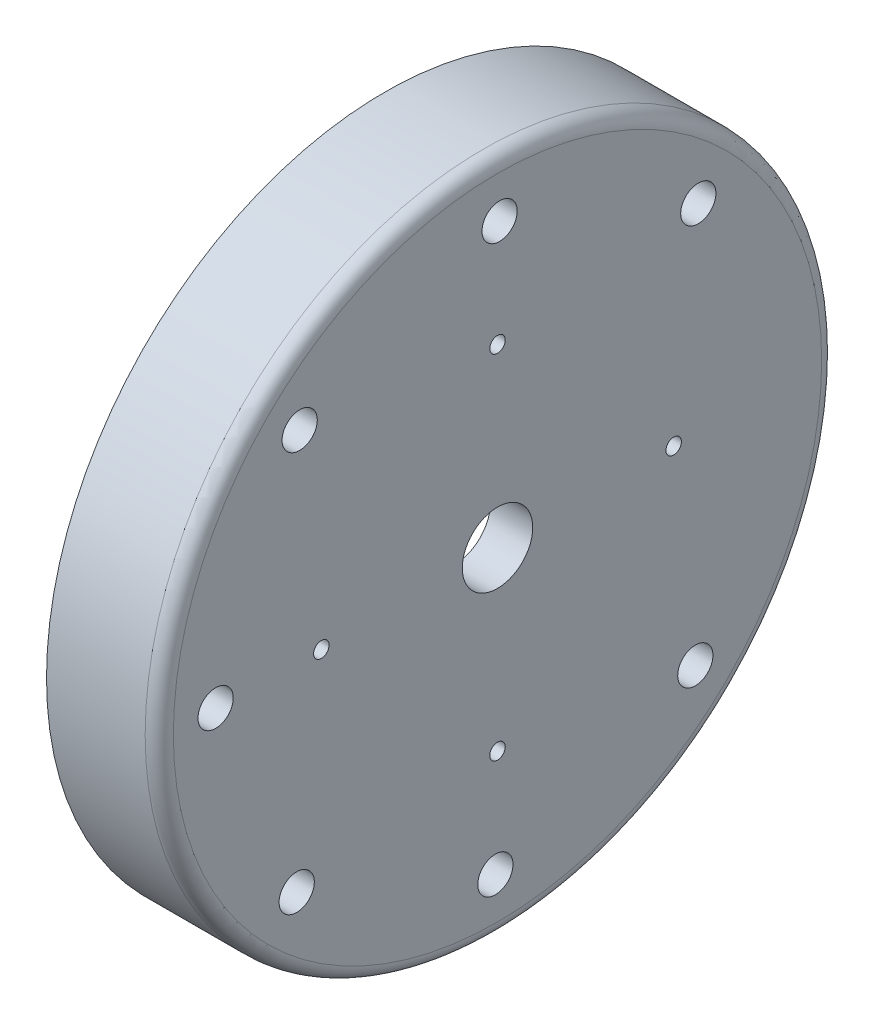
ISO-10303-21;
HEADER;
FILE_DESCRIPTION(('STEP AP214'),'2;1');
FILE_NAME('part.step','',(''),(''),'','','');
FILE_SCHEMA(('AUTOMOTIVE_DESIGN { 1 0 10303 214 1 1 1 1 }'));
ENDSEC;
DATA;
#1=APPLICATION_CONTEXT('core data for automotive mechanical design processes');
#2=APPLICATION_PROTOCOL_DEFINITION('international standard','automotive_design',2000,#1);
#3=PRODUCT_CONTEXT('',#1,'mechanical');
#4=PRODUCT('Part','Part','',(#3));
#5=PRODUCT_RELATED_PRODUCT_CATEGORY('part','',(#4));
#6=PRODUCT_DEFINITION_FORMATION('','',#4);
#7=PRODUCT_DEFINITION_CONTEXT('part definition',#1,'design');
#8=PRODUCT_DEFINITION('design','',#6,#7);
#9=PRODUCT_DEFINITION_SHAPE('','',#8);
#10=(LENGTH_UNIT() NAMED_UNIT(*) SI_UNIT(.MILLI.,.METRE.));
#11=(NAMED_UNIT(*) PLANE_ANGLE_UNIT() SI_UNIT($,.RADIAN.));
#12=(NAMED_UNIT(*) SI_UNIT($,.STERADIAN.) SOLID_ANGLE_UNIT());
#13=UNCERTAINTY_MEASURE_WITH_UNIT(LENGTH_MEASURE(1.E-05),#10,'distance_accuracy_value','');
#14=(GEOMETRIC_REPRESENTATION_CONTEXT(3) GLOBAL_UNCERTAINTY_ASSIGNED_CONTEXT((#13)) GLOBAL_UNIT_ASSIGNED_CONTEXT((#10,
#11,#12)) REPRESENTATION_CONTEXT('',''));
#15=CARTESIAN_POINT('',(0.,0.,0.));
#16=DIRECTION('',(0.,0.,1.));
#17=DIRECTION('',(1.,0.,0.));
#18=AXIS2_PLACEMENT_3D('',#15,#16,#17);
#19=CARTESIAN_POINT('',(20.32,0.,0.));
#20=DIRECTION('',(-1.,0.,0.));
#21=DIRECTION('',(0.,0.,1.));
#22=AXIS2_PLACEMENT_3D('',#19,#20,#21);
#23=CYLINDRICAL_SURFACE('',#22,60.96);
#24=CARTESIAN_POINT('',(17.78,0.,0.));
#25=DIRECTION('',(1.,0.,0.));
#26=DIRECTION('',(0.,0.,-1.));
#27=AXIS2_PLACEMENT_3D('',#24,#25,#26);
#28=CIRCLE('',#27,60.96);
#29=CARTESIAN_POINT('',(17.78,0.,-60.96));
#30=VERTEX_POINT('',#29);
#31=EDGE_CURVE('E11',#30,#30,#28,.F.);
#32=ORIENTED_EDGE('',*,*,#31,.T.);
#33=EDGE_LOOP('',(#32));
#34=FACE_BOUND('',#33,.T.);
#35=CARTESIAN_POINT('',(0.,0.,0.));
#36=DIRECTION('',(1.,0.,0.));
#37=DIRECTION('',(0.,0.,-1.));
#38=AXIS2_PLACEMENT_3D('',#35,#36,#37);
#39=CIRCLE('',#38,60.96);
#40=CARTESIAN_POINT('',(0.,0.,-60.96));
#41=VERTEX_POINT('',#40);
#42=EDGE_CURVE('E47',#41,#41,#39,.T.);
#43=ORIENTED_EDGE('',*,*,#42,.T.);
#44=EDGE_LOOP('',(#43));
#45=FACE_BOUND('',#44,.T.);
#46=ADVANCED_FACE('F35',(#34,#45),#23,.T.);
#47=CARTESIAN_POINT('',(20.32,0.,0.));
#48=DIRECTION('',(1.,0.,0.));
#49=DIRECTION('',(0.,0.,-1.));
#50=AXIS2_PLACEMENT_3D('',#47,#48,#49);
#51=PLANE('',#50);
#52=CARTESIAN_POINT('',(20.32,31.75,0.));
#53=DIRECTION('',(1.,0.,0.));
#54=DIRECTION('',(0.,0.,-1.));
#55=AXIS2_PLACEMENT_3D('',#52,#53,#54);
#56=CIRCLE('',#55,1.397);
#57=CARTESIAN_POINT('',(20.32,31.75,-1.397));
#58=VERTEX_POINT('',#57);
#59=EDGE_CURVE('E103',#58,#58,#56,.F.);
#60=ORIENTED_EDGE('',*,*,#59,.T.);
#61=EDGE_LOOP('',(#60));
#62=FACE_BOUND('',#61,.T.);
#63=CARTESIAN_POINT('',(20.32,-1.10854532508269E-13,31.75));
#64=DIRECTION('',(1.,0.,0.));
#65=DIRECTION('',(0.,0.,-1.));
#66=AXIS2_PLACEMENT_3D('',#63,#64,#65);
#67=CIRCLE('',#66,1.39700000000001);
#68=CARTESIAN_POINT('',(20.32,-1.10854532508269E-13,30.353));
#69=VERTEX_POINT('',#68);
#70=EDGE_CURVE('E117',#69,#69,#67,.F.);
#71=ORIENTED_EDGE('',*,*,#70,.T.);
#72=EDGE_LOOP('',(#71));
#73=FACE_BOUND('',#72,.T.);
#74=CARTESIAN_POINT('',(20.32,-31.75,-2.21709065016539E-13));
#75=DIRECTION('',(1.,0.,0.));
#76=DIRECTION('',(0.,0.,-1.));
#77=AXIS2_PLACEMENT_3D('',#74,#75,#76);
#78=CIRCLE('',#77,1.397);
#79=CARTESIAN_POINT('',(20.32,-31.75,-1.39700000000022));
#80=VERTEX_POINT('',#79);
#81=EDGE_CURVE('E111',#80,#80,#78,.F.);
#82=ORIENTED_EDGE('',*,*,#81,.T.);
#83=EDGE_LOOP('',(#82));
#84=FACE_BOUND('',#83,.T.);
#85=CARTESIAN_POINT('',(20.32,3.32563597524808E-13,-31.75));
#86=DIRECTION('',(1.,0.,0.));
#87=DIRECTION('',(0.,0.,-1.));
#88=AXIS2_PLACEMENT_3D('',#85,#86,#87);
#89=CIRCLE('',#88,1.397);
#90=CARTESIAN_POINT('',(20.32,3.32563597524808E-13,-33.147));
#91=VERTEX_POINT('',#90);
#92=EDGE_CURVE('E104',#91,#91,#89,.F.);
#93=ORIENTED_EDGE('',*,*,#92,.T.);
#94=EDGE_LOOP('',(#93));
#95=FACE_BOUND('',#94,.T.);
#96=CARTESIAN_POINT('',(20.32,50.7985782495741,-0.380062918335537));
#97=DIRECTION('',(-1.,0.,0.));
#98=DIRECTION('',(0.,-0.707106781186549,0.707106781186546));
#99=AXIS2_PLACEMENT_3D('',#96,#97,#98);
#100=CIRCLE('',#99,3.175);
#101=CARTESIAN_POINT('',(20.32,48.5535142193068,1.86500111193175));
#102=VERTEX_POINT('',#101);
#103=EDGE_CURVE('E59',#102,#102,#100,.T.);
#104=ORIENTED_EDGE('',*,*,#103,.T.);
#105=EDGE_LOOP('',(#104));
#106=FACE_BOUND('',#105,.T.);
#107=CARTESIAN_POINT('',(20.32,36.1887642217419,35.6512740880768));
#108=DIRECTION('',(-1.,0.,0.));
#109=DIRECTION('',(0.,-1.,0.));
#110=AXIS2_PLACEMENT_3D('',#107,#108,#109);
#111=CIRCLE('',#110,3.175);
#112=CARTESIAN_POINT('',(20.32,33.0137642217419,35.6512740880768));
#113=VERTEX_POINT('',#112);
#114=EDGE_CURVE('E89',#113,#113,#111,.T.);
#115=ORIENTED_EDGE('',*,*,#114,.T.);
#116=EDGE_LOOP('',(#115));
#117=FACE_BOUND('',#116,.T.);
#118=CARTESIAN_POINT('',(20.32,0.380062918335356,50.7985782495741));
#119=DIRECTION('',(-1.,0.,0.));
#120=DIRECTION('',(0.,-0.707106781186544,-0.707106781186551));
#121=AXIS2_PLACEMENT_3D('',#118,#119,#120);
#122=CIRCLE('',#121,3.175);
#123=CARTESIAN_POINT('',(20.32,-1.86500111193192,48.5535142193068));
#124=VERTEX_POINT('',#123);
#125=EDGE_CURVE('E83',#124,#124,#122,.T.);
#126=ORIENTED_EDGE('',*,*,#125,.T.);
#127=EDGE_LOOP('',(#126));
#128=FACE_BOUND('',#127,.T.);
#129=CARTESIAN_POINT('',(20.32,-35.6512740880767,36.188764221742));
#130=DIRECTION('',(-1.,0.,0.));
#131=DIRECTION('',(0.,0.,-1.));
#132=AXIS2_PLACEMENT_3D('',#129,#130,#131);
#133=CIRCLE('',#132,3.175);
#134=CARTESIAN_POINT('',(20.32,-35.6512740880767,33.013764221742));
#135=VERTEX_POINT('',#134);
#136=EDGE_CURVE('E77',#135,#135,#133,.T.);
#137=ORIENTED_EDGE('',*,*,#136,.T.);
#138=EDGE_LOOP('',(#137));
#139=FACE_BOUND('',#138,.T.);
#140=CARTESIAN_POINT('',(20.32,-50.7985782495741,0.380062918335179));
#141=DIRECTION('',(-1.,0.,0.));
#142=DIRECTION('',(0.,0.707106781186554,-0.707106781186541));
#143=AXIS2_PLACEMENT_3D('',#140,#141,#142);
#144=CIRCLE('',#143,3.175);
#145=CARTESIAN_POINT('',(20.32,-48.5535142193068,-1.86500111193209));
#146=VERTEX_POINT('',#145);
#147=EDGE_CURVE('E71',#146,#146,#144,.T.);
#148=ORIENTED_EDGE('',*,*,#147,.T.);
#149=EDGE_LOOP('',(#148));
#150=FACE_BOUND('',#149,.T.);
#151=CARTESIAN_POINT('',(20.32,-36.1887642217416,-35.651274088077));
#152=DIRECTION('',(-1.,0.,0.));
#153=DIRECTION('',(0.,1.,0.));
#154=AXIS2_PLACEMENT_3D('',#151,#152,#153);
#155=CIRCLE('',#154,3.175);
#156=CARTESIAN_POINT('',(20.32,-33.0137642217416,-35.651274088077));
#157=VERTEX_POINT('',#156);
#158=EDGE_CURVE('E65',#157,#157,#155,.T.);
#159=ORIENTED_EDGE('',*,*,#158,.T.);
#160=EDGE_LOOP('',(#159));
#161=FACE_BOUND('',#160,.T.);
#162=CARTESIAN_POINT('',(20.32,35.6512740880767,-36.188764221742));
#163=DIRECTION('',(-1.,0.,0.));
#164=DIRECTION('',(0.,0.,1.));
#165=AXIS2_PLACEMENT_3D('',#162,#163,#164);
#166=CIRCLE('',#165,3.175);
#167=CARTESIAN_POINT('',(20.32,35.6512740880767,-33.013764221742));
#168=VERTEX_POINT('',#167);
#169=EDGE_CURVE('E55',#168,#168,#166,.T.);
#170=ORIENTED_EDGE('',*,*,#169,.T.);
#171=EDGE_LOOP('',(#170));
#172=FACE_BOUND('',#171,.T.);
#173=CARTESIAN_POINT('',(20.32,0.,0.));
#174=DIRECTION('',(1.,0.,0.));
#175=DIRECTION('',(0.,0.,-1.));
#176=AXIS2_PLACEMENT_3D('',#173,#174,#175);
#177=CIRCLE('',#176,6.35);
#178=CARTESIAN_POINT('',(20.32,0.,-6.35));
#179=VERTEX_POINT('',#178);
#180=EDGE_CURVE('E52',#179,#179,#177,.T.);
#181=ORIENTED_EDGE('',*,*,#180,.F.);
#182=EDGE_LOOP('',(#181));
#183=FACE_BOUND('',#182,.T.);
#184=CARTESIAN_POINT('',(20.32,0.,0.));
#185=DIRECTION('',(1.,0.,0.));
#186=DIRECTION('',(0.,0.,-1.));
#187=AXIS2_PLACEMENT_3D('',#184,#185,#186);
#188=CIRCLE('',#187,58.42);
#189=CARTESIAN_POINT('',(20.32,0.,-58.42));
#190=VERTEX_POINT('',#189);
#191=EDGE_CURVE('E43',#190,#190,#188,.T.);
#192=ORIENTED_EDGE('',*,*,#191,.T.);
#193=EDGE_LOOP('',(#192));
#194=FACE_BOUND('',#193,.T.);
#195=ADVANCED_FACE('F155',(#62,#73,#84,#95,#106,#117,#128,#139,#150,#161,#172,#183,#194),#51,.T.);
#196=CARTESIAN_POINT('',(0.,0.,0.));
#197=DIRECTION('',(1.,0.,0.));
#198=DIRECTION('',(0.,0.,-1.));
#199=AXIS2_PLACEMENT_3D('',#196,#197,#198);
#200=PLANE('',#199);
#201=CARTESIAN_POINT('',(0.,0.,0.));
#202=DIRECTION('',(-1.,0.,0.));
#203=DIRECTION('',(0.,0.,1.));
#204=AXIS2_PLACEMENT_3D('',#201,#202,#203);
#205=CIRCLE('',#204,34.925);
#206=CARTESIAN_POINT('',(0.,0.,34.925));
#207=VERTEX_POINT('',#206);
#208=EDGE_CURVE('E100',#207,#207,#205,.T.);
#209=ORIENTED_EDGE('',*,*,#208,.F.);
#210=EDGE_LOOP('',(#209));
#211=FACE_BOUND('',#210,.T.);
#212=CARTESIAN_POINT('',(0.,50.7985782495741,-0.380062918335537));
#213=DIRECTION('',(-1.,0.,0.));
#214=DIRECTION('',(0.,-0.707106781186549,0.707106781186546));
#215=AXIS2_PLACEMENT_3D('',#212,#213,#214);
#216=CIRCLE('',#215,3.175);
#217=CARTESIAN_POINT('',(0.,48.5535142193068,1.86500111193175));
#218=VERTEX_POINT('',#217);
#219=EDGE_CURVE('E92',#218,#218,#216,.T.);
#220=ORIENTED_EDGE('',*,*,#219,.F.);
#221=EDGE_LOOP('',(#220));
#222=FACE_BOUND('',#221,.T.);
#223=CARTESIAN_POINT('',(0.,36.1887642217419,35.6512740880768));
#224=DIRECTION('',(-1.,0.,0.));
#225=DIRECTION('',(0.,-1.,0.));
#226=AXIS2_PLACEMENT_3D('',#223,#224,#225);
#227=CIRCLE('',#226,3.175);
#228=CARTESIAN_POINT('',(0.,33.0137642217419,35.6512740880768));
#229=VERTEX_POINT('',#228);
#230=EDGE_CURVE('E86',#229,#229,#227,.T.);
#231=ORIENTED_EDGE('',*,*,#230,.F.);
#232=EDGE_LOOP('',(#231));
#233=FACE_BOUND('',#232,.T.);
#234=CARTESIAN_POINT('',(0.,0.380062918335356,50.7985782495741));
#235=DIRECTION('',(-1.,0.,0.));
#236=DIRECTION('',(0.,-0.707106781186544,-0.707106781186551));
#237=AXIS2_PLACEMENT_3D('',#234,#235,#236);
#238=CIRCLE('',#237,3.175);
#239=CARTESIAN_POINT('',(0.,-1.86500111193192,48.5535142193068));
#240=VERTEX_POINT('',#239);
#241=EDGE_CURVE('E80',#240,#240,#238,.T.);
#242=ORIENTED_EDGE('',*,*,#241,.F.);
#243=EDGE_LOOP('',(#242));
#244=FACE_BOUND('',#243,.T.);
#245=CARTESIAN_POINT('',(0.,-35.6512740880767,36.188764221742));
#246=DIRECTION('',(-1.,0.,0.));
#247=DIRECTION('',(0.,0.,-1.));
#248=AXIS2_PLACEMENT_3D('',#245,#246,#247);
#249=CIRCLE('',#248,3.175);
#250=CARTESIAN_POINT('',(0.,-35.6512740880767,33.013764221742));
#251=VERTEX_POINT('',#250);
#252=EDGE_CURVE('E74',#251,#251,#249,.T.);
#253=ORIENTED_EDGE('',*,*,#252,.F.);
#254=EDGE_LOOP('',(#253));
#255=FACE_BOUND('',#254,.T.);
#256=CARTESIAN_POINT('',(0.,-50.7985782495741,0.380062918335179));
#257=DIRECTION('',(-1.,0.,0.));
#258=DIRECTION('',(0.,0.707106781186554,-0.707106781186541));
#259=AXIS2_PLACEMENT_3D('',#256,#257,#258);
#260=CIRCLE('',#259,3.175);
#261=CARTESIAN_POINT('',(0.,-48.5535142193068,-1.86500111193209));
#262=VERTEX_POINT('',#261);
#263=EDGE_CURVE('E68',#262,#262,#260,.T.);
#264=ORIENTED_EDGE('',*,*,#263,.F.);
#265=EDGE_LOOP('',(#264));
#266=FACE_BOUND('',#265,.T.);
#267=CARTESIAN_POINT('',(0.,-36.1887642217416,-35.651274088077));
#268=DIRECTION('',(-1.,0.,0.));
#269=DIRECTION('',(0.,1.,0.));
#270=AXIS2_PLACEMENT_3D('',#267,#268,#269);
#271=CIRCLE('',#270,3.175);
#272=CARTESIAN_POINT('',(0.,-33.0137642217416,-35.651274088077));
#273=VERTEX_POINT('',#272);
#274=EDGE_CURVE('E62',#273,#273,#271,.T.);
#275=ORIENTED_EDGE('',*,*,#274,.F.);
#276=EDGE_LOOP('',(#275));
#277=FACE_BOUND('',#276,.T.);
#278=CARTESIAN_POINT('',(0.,35.6512740880767,-36.188764221742));
#279=DIRECTION('',(-1.,0.,0.));
#280=DIRECTION('',(0.,0.,1.));
#281=AXIS2_PLACEMENT_3D('',#278,#279,#280);
#282=CIRCLE('',#281,3.175);
#283=CARTESIAN_POINT('',(0.,35.6512740880767,-33.013764221742));
#284=VERTEX_POINT('',#283);
#285=EDGE_CURVE('E56',#284,#284,#282,.T.);
#286=ORIENTED_EDGE('',*,*,#285,.F.);
#287=EDGE_LOOP('',(#286));
#288=FACE_BOUND('',#287,.T.);
#289=ORIENTED_EDGE('',*,*,#42,.F.);
#290=EDGE_LOOP('',(#289));
#291=FACE_BOUND('',#290,.T.);
#292=ADVANCED_FACE('F158',(#211,#222,#233,#244,#255,#266,#277,#288,#291),#200,.F.);
#293=CARTESIAN_POINT('',(17.78,0.,0.));
#294=DIRECTION('',(1.,0.,0.));
#295=DIRECTION('',(0.,0.,-1.));
#296=AXIS2_PLACEMENT_3D('',#293,#294,#295);
#297=TOROIDAL_SURFACE('',#296,58.42,2.54);
#298=ORIENTED_EDGE('',*,*,#31,.F.);
#299=EDGE_LOOP('',(#298));
#300=FACE_BOUND('',#299,.T.);
#301=ORIENTED_EDGE('',*,*,#191,.F.);
#302=EDGE_LOOP('',(#301));
#303=FACE_BOUND('',#302,.T.);
#304=ADVANCED_FACE('F37',(#300,#303),#297,.T.);
#305=CARTESIAN_POINT('',(0.,0.,0.));
#306=DIRECTION('',(1.,0.,0.));
#307=DIRECTION('',(0.,0.,-1.));
#308=AXIS2_PLACEMENT_3D('',#305,#306,#307);
#309=CYLINDRICAL_SURFACE('',#308,6.35);
#310=CARTESIAN_POINT('',(12.7,0.,0.));
#311=DIRECTION('',(1.,0.,0.));
#312=DIRECTION('',(0.,0.,-1.));
#313=AXIS2_PLACEMENT_3D('',#310,#311,#312);
#314=CIRCLE('',#313,6.35);
#315=CARTESIAN_POINT('',(12.7,0.,-6.35));
#316=VERTEX_POINT('',#315);
#317=EDGE_CURVE('E39',#316,#316,#314,.F.);
#318=ORIENTED_EDGE('',*,*,#317,.T.);
#319=EDGE_LOOP('',(#318));
#320=FACE_BOUND('',#319,.T.);
#321=ORIENTED_EDGE('',*,*,#180,.T.);
#322=EDGE_LOOP('',(#321));
#323=FACE_BOUND('',#322,.T.);
#324=ADVANCED_FACE('F148',(#320,#323),#309,.F.);
#325=CARTESIAN_POINT('',(20.32,35.6512740880767,-36.188764221742));
#326=DIRECTION('',(-1.,0.,0.));
#327=DIRECTION('',(0.,0.,1.));
#328=AXIS2_PLACEMENT_3D('',#325,#326,#327);
#329=CYLINDRICAL_SURFACE('',#328,3.175);
#330=ORIENTED_EDGE('',*,*,#169,.F.);
#331=EDGE_LOOP('',(#330));
#332=FACE_BOUND('',#331,.T.);
#333=ORIENTED_EDGE('',*,*,#285,.T.);
#334=EDGE_LOOP('',(#333));
#335=FACE_BOUND('',#334,.T.);
#336=ADVANCED_FACE('F151',(#332,#335),#329,.F.);
#337=CARTESIAN_POINT('',(20.32,-36.1887642217416,-35.651274088077));
#338=DIRECTION('',(-1.,0.,0.));
#339=DIRECTION('',(0.,0.,1.));
#340=AXIS2_PLACEMENT_3D('',#337,#338,#339);
#341=CYLINDRICAL_SURFACE('',#340,3.175);
#342=ORIENTED_EDGE('',*,*,#158,.F.);
#343=EDGE_LOOP('',(#342));
#344=FACE_BOUND('',#343,.T.);
#345=ORIENTED_EDGE('',*,*,#274,.T.);
#346=EDGE_LOOP('',(#345));
#347=FACE_BOUND('',#346,.T.);
#348=ADVANCED_FACE('F177',(#344,#347),#341,.F.);
#349=CARTESIAN_POINT('',(20.32,-50.7985782495741,0.380062918335179));
#350=DIRECTION('',(-1.,0.,0.));
#351=DIRECTION('',(0.,0.,1.));
#352=AXIS2_PLACEMENT_3D('',#349,#350,#351);
#353=CYLINDRICAL_SURFACE('',#352,3.175);
#354=ORIENTED_EDGE('',*,*,#147,.F.);
#355=EDGE_LOOP('',(#354));
#356=FACE_BOUND('',#355,.T.);
#357=ORIENTED_EDGE('',*,*,#263,.T.);
#358=EDGE_LOOP('',(#357));
#359=FACE_BOUND('',#358,.T.);
#360=ADVANCED_FACE('F181',(#356,#359),#353,.F.);
#361=CARTESIAN_POINT('',(20.32,-35.6512740880767,36.188764221742));
#362=DIRECTION('',(-1.,0.,0.));
#363=DIRECTION('',(0.,0.,1.));
#364=AXIS2_PLACEMENT_3D('',#361,#362,#363);
#365=CYLINDRICAL_SURFACE('',#364,3.175);
#366=ORIENTED_EDGE('',*,*,#136,.F.);
#367=EDGE_LOOP('',(#366));
#368=FACE_BOUND('',#367,.T.);
#369=ORIENTED_EDGE('',*,*,#252,.T.);
#370=EDGE_LOOP('',(#369));
#371=FACE_BOUND('',#370,.T.);
#372=ADVANCED_FACE('F185',(#368,#371),#365,.F.);
#373=CARTESIAN_POINT('',(20.32,0.380062918335356,50.7985782495741));
#374=DIRECTION('',(-1.,0.,0.));
#375=DIRECTION('',(0.,0.,1.));
#376=AXIS2_PLACEMENT_3D('',#373,#374,#375);
#377=CYLINDRICAL_SURFACE('',#376,3.175);
#378=ORIENTED_EDGE('',*,*,#125,.F.);
#379=EDGE_LOOP('',(#378));
#380=FACE_BOUND('',#379,.T.);
#381=ORIENTED_EDGE('',*,*,#241,.T.);
#382=EDGE_LOOP('',(#381));
#383=FACE_BOUND('',#382,.T.);
#384=ADVANCED_FACE('F189',(#380,#383),#377,.F.);
#385=CARTESIAN_POINT('',(20.32,36.1887642217419,35.6512740880768));
#386=DIRECTION('',(-1.,0.,0.));
#387=DIRECTION('',(0.,0.,1.));
#388=AXIS2_PLACEMENT_3D('',#385,#386,#387);
#389=CYLINDRICAL_SURFACE('',#388,3.175);
#390=ORIENTED_EDGE('',*,*,#114,.F.);
#391=EDGE_LOOP('',(#390));
#392=FACE_BOUND('',#391,.T.);
#393=ORIENTED_EDGE('',*,*,#230,.T.);
#394=EDGE_LOOP('',(#393));
#395=FACE_BOUND('',#394,.T.);
#396=ADVANCED_FACE('F193',(#392,#395),#389,.F.);
#397=CARTESIAN_POINT('',(20.32,50.7985782495741,-0.380062918335537));
#398=DIRECTION('',(-1.,0.,0.));
#399=DIRECTION('',(0.,0.,1.));
#400=AXIS2_PLACEMENT_3D('',#397,#398,#399);
#401=CYLINDRICAL_SURFACE('',#400,3.175);
#402=ORIENTED_EDGE('',*,*,#103,.F.);
#403=EDGE_LOOP('',(#402));
#404=FACE_BOUND('',#403,.T.);
#405=ORIENTED_EDGE('',*,*,#219,.T.);
#406=EDGE_LOOP('',(#405));
#407=FACE_BOUND('',#406,.T.);
#408=ADVANCED_FACE('F135',(#404,#407),#401,.F.);
#409=CARTESIAN_POINT('',(12.7,0.,0.));
#410=DIRECTION('',(1.,0.,0.));
#411=DIRECTION('',(0.,0.,-1.));
#412=AXIS2_PLACEMENT_3D('',#409,#410,#411);
#413=PLANE('',#412);
#414=CARTESIAN_POINT('',(12.7,31.75,0.));
#415=DIRECTION('',(-1.,0.,0.));
#416=DIRECTION('',(0.,0.,1.));
#417=AXIS2_PLACEMENT_3D('',#414,#415,#416);
#418=CIRCLE('',#417,1.397);
#419=CARTESIAN_POINT('',(12.7,31.75,1.397));
#420=VERTEX_POINT('',#419);
#421=EDGE_CURVE('E120',#420,#420,#418,.T.);
#422=ORIENTED_EDGE('',*,*,#421,.F.);
#423=EDGE_LOOP('',(#422));
#424=FACE_BOUND('',#423,.T.);
#425=CARTESIAN_POINT('',(12.7,-1.10854532508269E-13,31.75));
#426=DIRECTION('',(-1.,0.,0.));
#427=DIRECTION('',(0.,0.,1.));
#428=AXIS2_PLACEMENT_3D('',#425,#426,#427);
#429=CIRCLE('',#428,1.39700000000001);
#430=CARTESIAN_POINT('',(12.7,-1.10854532508269E-13,33.147));
#431=VERTEX_POINT('',#430);
#432=EDGE_CURVE('E114',#431,#431,#429,.T.);
#433=ORIENTED_EDGE('',*,*,#432,.F.);
#434=EDGE_LOOP('',(#433));
#435=FACE_BOUND('',#434,.T.);
#436=CARTESIAN_POINT('',(12.7,-31.75,-2.21709065016539E-13));
#437=DIRECTION('',(-1.,0.,0.));
#438=DIRECTION('',(0.,0.,1.));
#439=AXIS2_PLACEMENT_3D('',#436,#437,#438);
#440=CIRCLE('',#439,1.397);
#441=CARTESIAN_POINT('',(12.7,-31.75,1.39699999999978));
#442=VERTEX_POINT('',#441);
#443=EDGE_CURVE('E107',#442,#442,#440,.T.);
#444=ORIENTED_EDGE('',*,*,#443,.F.);
#445=EDGE_LOOP('',(#444));
#446=FACE_BOUND('',#445,.T.);
#447=CARTESIAN_POINT('',(12.7,3.32563597524808E-13,-31.75));
#448=DIRECTION('',(-1.,0.,0.));
#449=DIRECTION('',(0.,0.,1.));
#450=AXIS2_PLACEMENT_3D('',#447,#448,#449);
#451=CIRCLE('',#450,1.397);
#452=CARTESIAN_POINT('',(12.7,3.32563597524808E-13,-30.353));
#453=VERTEX_POINT('',#452);
#454=EDGE_CURVE('E108',#453,#453,#451,.T.);
#455=ORIENTED_EDGE('',*,*,#454,.F.);
#456=EDGE_LOOP('',(#455));
#457=FACE_BOUND('',#456,.T.);
#458=CARTESIAN_POINT('',(12.7,0.,0.));
#459=DIRECTION('',(1.,0.,0.));
#460=DIRECTION('',(0.,0.,-1.));
#461=AXIS2_PLACEMENT_3D('',#458,#459,#460);
#462=CIRCLE('',#461,34.925);
#463=CARTESIAN_POINT('',(12.7,0.,34.925));
#464=VERTEX_POINT('',#463);
#465=EDGE_CURVE('E97',#464,#464,#462,.F.);
#466=ORIENTED_EDGE('',*,*,#465,.T.);
#467=EDGE_LOOP('',(#466));
#468=FACE_BOUND('',#467,.T.);
#469=ORIENTED_EDGE('',*,*,#317,.F.);
#470=EDGE_LOOP('',(#469));
#471=FACE_BOUND('',#470,.T.);
#472=ADVANCED_FACE('F131',(#424,#435,#446,#457,#468,#471),#413,.F.);
#473=CARTESIAN_POINT('',(119.102817331761,0.,0.));
#474=DIRECTION('',(-1.,0.,0.));
#475=DIRECTION('',(0.,0.,1.));
#476=AXIS2_PLACEMENT_3D('',#473,#474,#475);
#477=CYLINDRICAL_SURFACE('',#476,34.925);
#478=CARTESIAN_POINT('',(0.,0.,34.925));
#479=CARTESIAN_POINT('',(0.132291666666668,0.,34.925));
#480=CARTESIAN_POINT('',(0.264583333333337,0.,34.925));
#481=CARTESIAN_POINT('',(0.529166666666669,0.,34.925));
#482=CARTESIAN_POINT('',(0.661458333333332,0.,34.925));
#483=CARTESIAN_POINT('',(0.926041666666664,0.,34.925));
#484=CARTESIAN_POINT('',(1.05833333333333,0.,34.925));
#485=CARTESIAN_POINT('',(1.32291666666666,0.,34.925));
#486=CARTESIAN_POINT('',(1.45520833333333,0.,34.925));
#487=CARTESIAN_POINT('',(1.71979166666666,0.,34.925));
#488=CARTESIAN_POINT('',(1.85208333333333,0.,34.925));
#489=CARTESIAN_POINT('',(2.11666666666666,0.,34.925));
#490=CARTESIAN_POINT('',(2.24895833333333,0.,34.925));
#491=CARTESIAN_POINT('',(2.51354166666667,0.,34.925));
#492=CARTESIAN_POINT('',(2.64583333333333,0.,34.925));
#493=CARTESIAN_POINT('',(2.91041666666666,0.,34.925));
#494=CARTESIAN_POINT('',(3.04270833333333,0.,34.925));
#495=CARTESIAN_POINT('',(3.30729166666667,0.,34.925));
#496=CARTESIAN_POINT('',(3.43958333333333,0.,34.925));
#497=CARTESIAN_POINT('',(3.70416666666667,0.,34.925));
#498=CARTESIAN_POINT('',(3.83645833333333,0.,34.925));
#499=CARTESIAN_POINT('',(4.10104166666666,0.,34.925));
#500=CARTESIAN_POINT('',(4.23333333333333,0.,34.925));
#501=CARTESIAN_POINT('',(4.49791666666667,0.,34.925));
#502=CARTESIAN_POINT('',(4.63020833333333,0.,34.925));
#503=CARTESIAN_POINT('',(4.89479166666667,0.,34.925));
#504=CARTESIAN_POINT('',(5.02708333333333,0.,34.925));
#505=CARTESIAN_POINT('',(5.29166666666666,0.,34.925));
#506=CARTESIAN_POINT('',(5.42395833333333,0.,34.925));
#507=CARTESIAN_POINT('',(5.68854166666666,0.,34.925));
#508=CARTESIAN_POINT('',(5.82083333333333,0.,34.925));
#509=CARTESIAN_POINT('',(6.08541666666666,0.,34.925));
#510=CARTESIAN_POINT('',(6.21770833333333,0.,34.925));
#511=CARTESIAN_POINT('',(6.48229166666666,0.,34.925));
#512=CARTESIAN_POINT('',(6.61458333333333,0.,34.925));
#513=CARTESIAN_POINT('',(6.87916666666666,0.,34.925));
#514=CARTESIAN_POINT('',(7.01145833333333,0.,34.925));
#515=CARTESIAN_POINT('',(7.27604166666666,0.,34.925));
#516=CARTESIAN_POINT('',(7.40833333333333,0.,34.925));
#517=CARTESIAN_POINT('',(7.67291666666666,0.,34.925));
#518=CARTESIAN_POINT('',(7.80520833333332,0.,34.925));
#519=CARTESIAN_POINT('',(8.06979166666665,0.,34.925));
#520=CARTESIAN_POINT('',(8.20208333333332,0.,34.925));
#521=CARTESIAN_POINT('',(8.46666666666666,0.,34.925));
#522=CARTESIAN_POINT('',(8.59895833333333,0.,34.925));
#523=CARTESIAN_POINT('',(8.86354166666666,0.,34.925));
#524=CARTESIAN_POINT('',(8.99583333333332,0.,34.925));
#525=CARTESIAN_POINT('',(9.26041666666666,0.,34.925));
#526=CARTESIAN_POINT('',(9.39270833333332,0.,34.925));
#527=CARTESIAN_POINT('',(9.65729166666666,0.,34.925));
#528=CARTESIAN_POINT('',(9.78958333333333,0.,34.925));
#529=CARTESIAN_POINT('',(10.0541666666667,0.,34.925));
#530=CARTESIAN_POINT('',(10.1864583333333,0.,34.925));
#531=CARTESIAN_POINT('',(10.4510416666667,0.,34.925));
#532=CARTESIAN_POINT('',(10.5833333333333,0.,34.925));
#533=CARTESIAN_POINT('',(10.8479166666667,0.,34.925));
#534=CARTESIAN_POINT('',(10.9802083333333,0.,34.925));
#535=CARTESIAN_POINT('',(11.2447916666667,0.,34.925));
#536=CARTESIAN_POINT('',(11.3770833333333,0.,34.925));
#537=CARTESIAN_POINT('',(11.6416666666667,0.,34.925));
#538=CARTESIAN_POINT('',(11.7739583333333,0.,34.925));
#539=CARTESIAN_POINT('',(12.0385416666667,0.,34.925));
#540=CARTESIAN_POINT('',(12.1708333333333,0.,34.925));
#541=CARTESIAN_POINT('',(12.4354166666667,0.,34.925));
#542=CARTESIAN_POINT('',(12.5677083333333,0.,34.925));
#543=CARTESIAN_POINT('',(12.7,0.,34.925));
#544=B_SPLINE_CURVE_WITH_KNOTS('',3,(#478,#479,#480,#481,#482,#483,#484,#485,#486,#487,#488,
#489,#490,#491,#492,#493,#494,#495,#496,#497,#498,#499,#500,#501,#502,#503,#504,#505,#506,#507,
#508,#509,#510,#511,#512,#513,#514,#515,#516,#517,#518,#519,#520,#521,#522,#523,#524,#525,#526,
#527,#528,#529,#530,#531,#532,#533,#534,#535,#536,#537,#538,#539,#540,#541,#542,#543),
.UNSPECIFIED.,.F.,.F.,(4,2,2,2,2,2,2,2,2,2,2,2,2,2,2,2,2,2,2,2,2,2,2,2,2,2,2,2,2,2,2,2,4),(0.,
0.396875000000005,0.793749999999996,1.190625,1.58749999999999,1.984375,2.38125,2.77812499999999,
3.175,3.571875,3.96874999999999,4.365625,4.7625,5.15937499999999,5.55625,5.95312499999999,
6.34999999999999,6.746875,7.14374999999999,7.540625,7.93749999999999,8.33437499999999,8.73125,
9.12812499999999,9.52499999999999,9.921875,10.31875,10.715625,11.1125,11.509375,11.90625,
12.303125,12.7),.UNSPECIFIED.);
#545=EDGE_CURVE('BSEAM134',#207,#464,#544,.T.);
#546=ORIENTED_EDGE('',*,*,#208,.T.);
#547=ORIENTED_EDGE('',*,*,#465,.F.);
#548=ORIENTED_EDGE('',*,*,#545,.T.);
#549=ORIENTED_EDGE('',*,*,#545,.F.);
#550=EDGE_LOOP('',(#546,#548,#547,#549));
#551=FACE_BOUND('',#550,.T.);
#552=ADVANCED_FACE('F134',(#551),#477,.F.);
#553=CARTESIAN_POINT('',(24.2713126932704,3.32563597524808E-13,-31.75));
#554=DIRECTION('',(-1.,0.,0.));
#555=DIRECTION('',(0.,0.,1.));
#556=AXIS2_PLACEMENT_3D('',#553,#554,#555);
#557=CYLINDRICAL_SURFACE('',#556,1.397);
#558=ORIENTED_EDGE('',*,*,#454,.T.);
#559=EDGE_LOOP('',(#558));
#560=FACE_BOUND('',#559,.T.);
#561=ORIENTED_EDGE('',*,*,#92,.F.);
#562=EDGE_LOOP('',(#561));
#563=FACE_BOUND('',#562,.T.);
#564=ADVANCED_FACE('F203',(#560,#563),#557,.F.);
#565=CARTESIAN_POINT('',(24.2713126932704,-31.75,-2.21709065016539E-13));
#566=DIRECTION('',(-1.,0.,0.));
#567=DIRECTION('',(0.,0.,1.));
#568=AXIS2_PLACEMENT_3D('',#565,#566,#567);
#569=CYLINDRICAL_SURFACE('',#568,1.397);
#570=ORIENTED_EDGE('',*,*,#443,.T.);
#571=EDGE_LOOP('',(#570));
#572=FACE_BOUND('',#571,.T.);
#573=ORIENTED_EDGE('',*,*,#81,.F.);
#574=EDGE_LOOP('',(#573));
#575=FACE_BOUND('',#574,.T.);
#576=ADVANCED_FACE('F207',(#572,#575),#569,.F.);
#577=CARTESIAN_POINT('',(24.2713126932704,-1.10854532508269E-13,31.75));
#578=DIRECTION('',(-1.,0.,0.));
#579=DIRECTION('',(0.,0.,1.));
#580=AXIS2_PLACEMENT_3D('',#577,#578,#579);
#581=CYLINDRICAL_SURFACE('',#580,1.39700000000001);
#582=ORIENTED_EDGE('',*,*,#432,.T.);
#583=EDGE_LOOP('',(#582));
#584=FACE_BOUND('',#583,.T.);
#585=ORIENTED_EDGE('',*,*,#70,.F.);
#586=EDGE_LOOP('',(#585));
#587=FACE_BOUND('',#586,.T.);
#588=ADVANCED_FACE('F211',(#584,#587),#581,.F.);
#589=CARTESIAN_POINT('',(24.2713126932704,31.75,0.));
#590=DIRECTION('',(-1.,0.,0.));
#591=DIRECTION('',(0.,0.,1.));
#592=AXIS2_PLACEMENT_3D('',#589,#590,#591);
#593=CYLINDRICAL_SURFACE('',#592,1.397);
#594=ORIENTED_EDGE('',*,*,#421,.T.);
#595=EDGE_LOOP('',(#594));
#596=FACE_BOUND('',#595,.T.);
#597=ORIENTED_EDGE('',*,*,#59,.F.);
#598=EDGE_LOOP('',(#597));
#599=FACE_BOUND('',#598,.T.);
#600=ADVANCED_FACE('F128',(#596,#599),#593,.F.);
#601=CLOSED_SHELL('',(#46,#195,#292,#304,#324,#336,#348,#360,#372,#384,#396,#408,#472,#552,#564,
#576,#588,#600));
#602=MANIFOLD_SOLID_BREP('B2',#601);
#603=ADVANCED_BREP_SHAPE_REPRESENTATION('',(#18,#602),#14);
#604=SHAPE_DEFINITION_REPRESENTATION(#9,#603);
ENDSEC;
END-ISO-10303-21;
